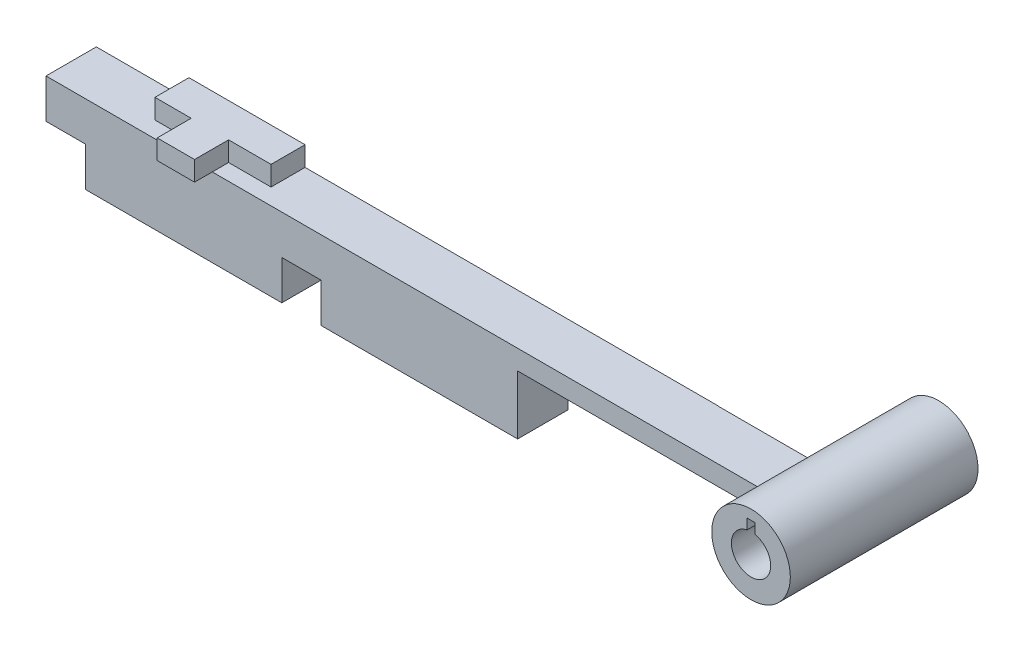
ISO-10303-21;
HEADER;
FILE_DESCRIPTION(('STEP AP214'),'2;1');
FILE_NAME('part.step','',(''),(''),'','','');
FILE_SCHEMA(('AUTOMOTIVE_DESIGN { 1 0 10303 214 1 1 1 1 }'));
ENDSEC;
DATA;
#1=APPLICATION_CONTEXT('core data for automotive mechanical design processes');
#2=APPLICATION_PROTOCOL_DEFINITION('international standard','automotive_design',2000,#1);
#3=PRODUCT_CONTEXT('',#1,'mechanical');
#4=PRODUCT('Part','Part','',(#3));
#5=PRODUCT_RELATED_PRODUCT_CATEGORY('part','',(#4));
#6=PRODUCT_DEFINITION_FORMATION('','',#4);
#7=PRODUCT_DEFINITION_CONTEXT('part definition',#1,'design');
#8=PRODUCT_DEFINITION('design','',#6,#7);
#9=PRODUCT_DEFINITION_SHAPE('','',#8);
#10=(LENGTH_UNIT() NAMED_UNIT(*) SI_UNIT(.MILLI.,.METRE.));
#11=(NAMED_UNIT(*) PLANE_ANGLE_UNIT() SI_UNIT($,.RADIAN.));
#12=(NAMED_UNIT(*) SI_UNIT($,.STERADIAN.) SOLID_ANGLE_UNIT());
#13=UNCERTAINTY_MEASURE_WITH_UNIT(LENGTH_MEASURE(1.E-05),#10,'distance_accuracy_value','');
#14=(GEOMETRIC_REPRESENTATION_CONTEXT(3) GLOBAL_UNCERTAINTY_ASSIGNED_CONTEXT((#13)) GLOBAL_UNIT_ASSIGNED_CONTEXT((#10,
#11,#12)) REPRESENTATION_CONTEXT('',''));
#15=CARTESIAN_POINT('',(0.,0.,0.));
#16=DIRECTION('',(0.,0.,1.));
#17=DIRECTION('',(1.,0.,0.));
#18=AXIS2_PLACEMENT_3D('',#15,#16,#17);
#19=CARTESIAN_POINT('',(41.4283489434981,7.40393666117241,-4.));
#20=DIRECTION('',(0.,0.,1.));
#21=DIRECTION('',(1.,0.,0.));
#22=AXIS2_PLACEMENT_3D('',#19,#20,#21);
#23=PLANE('',#22);
#24=CARTESIAN_POINT('',(41.4283489434981,7.40393666117241,-4.));
#25=DIRECTION('',(0.,0.,1.));
#26=DIRECTION('',(1.,0.,0.));
#27=AXIS2_PLACEMENT_3D('',#24,#25,#26);
#28=CIRCLE('',#27,2.);
#29=CARTESIAN_POINT('',(43.4283489434981,7.40393666117241,-4.));
#30=VERTEX_POINT('',#29);
#31=EDGE_CURVE('E388',#30,#30,#28,.T.);
#32=ORIENTED_EDGE('',*,*,#31,.F.);
#33=EDGE_LOOP('',(#32));
#34=FACE_BOUND('',#33,.T.);
#35=DIRECTION('',(0.,-1.,0.));
#36=VECTOR('',#35,1.);
#37=CARTESIAN_POINT('',(41.6283489434981,7.40393666117241,-4.));
#38=LINE('',#37,#36);
#39=CARTESIAN_POINT('',(41.6283489434981,8.9039366611724,-4.));
#40=VERTEX_POINT('',#39);
#41=CARTESIAN_POINT('',(41.6283489434981,8.38373255828568,-4.));
#42=VERTEX_POINT('',#41);
#43=EDGE_CURVE('E342',#40,#42,#38,.T.);
#44=ORIENTED_EDGE('',*,*,#43,.F.);
#45=DIRECTION('',(-1.,0.,0.));
#46=VECTOR('',#45,1.);
#47=CARTESIAN_POINT('',(41.4283489434981,8.9039366611724,-4.));
#48=LINE('',#47,#46);
#49=CARTESIAN_POINT('',(41.2283489434981,8.9039366611724,-4.));
#50=VERTEX_POINT('',#49);
#51=EDGE_CURVE('E378',#40,#50,#48,.T.);
#52=ORIENTED_EDGE('',*,*,#51,.T.);
#53=DIRECTION('',(0.,-1.,0.));
#54=VECTOR('',#53,1.);
#55=CARTESIAN_POINT('',(41.2283489434981,7.40393666117241,-4.));
#56=LINE('',#55,#54);
#57=CARTESIAN_POINT('',(41.2283489434981,8.38373255828568,-4.));
#58=VERTEX_POINT('',#57);
#59=EDGE_CURVE('E374',#50,#58,#56,.T.);
#60=ORIENTED_EDGE('',*,*,#59,.T.);
#61=CARTESIAN_POINT('',(41.4283489434981,7.40393666117241,-4.));
#62=DIRECTION('',(0.,0.,1.));
#63=DIRECTION('',(1.,0.,0.));
#64=AXIS2_PLACEMENT_3D('',#61,#62,#63);
#65=CIRCLE('',#64,0.999999999999998);
#66=EDGE_CURVE('E366',#58,#42,#65,.T.);
#67=ORIENTED_EDGE('',*,*,#66,.T.);
#68=EDGE_LOOP('',(#44,#52,#60,#67));
#69=FACE_BOUND('',#68,.T.);
#70=ADVANCED_FACE('F120',(#34,#69),#23,.F.);
#71=CARTESIAN_POINT('',(41.4283489434981,7.40393666117241,5.55));
#72=DIRECTION('',(0.,0.,1.));
#73=DIRECTION('',(1.,0.,0.));
#74=AXIS2_PLACEMENT_3D('',#71,#72,#73);
#75=PLANE('',#74);
#76=CARTESIAN_POINT('',(41.4283489434981,7.40393666117241,5.55));
#77=DIRECTION('',(0.,0.,1.));
#78=DIRECTION('',(1.,0.,0.));
#79=AXIS2_PLACEMENT_3D('',#76,#77,#78);
#80=CIRCLE('',#79,2.);
#81=CARTESIAN_POINT('',(43.4283489434981,7.40393666117241,5.55));
#82=VERTEX_POINT('',#81);
#83=EDGE_CURVE('E384',#82,#82,#80,.T.);
#84=ORIENTED_EDGE('',*,*,#83,.T.);
#85=EDGE_LOOP('',(#84));
#86=FACE_BOUND('',#85,.T.);
#87=DIRECTION('',(-1.,0.,0.));
#88=VECTOR('',#87,1.);
#89=CARTESIAN_POINT('',(0.,8.9039366611724,5.55));
#90=LINE('',#89,#88);
#91=CARTESIAN_POINT('',(41.6283489434981,8.9039366611724,5.55));
#92=VERTEX_POINT('',#91);
#93=CARTESIAN_POINT('',(41.2283489434981,8.9039366611724,5.55));
#94=VERTEX_POINT('',#93);
#95=EDGE_CURVE('E356',#92,#94,#90,.T.);
#96=ORIENTED_EDGE('',*,*,#95,.F.);
#97=DIRECTION('',(0.,-1.,0.));
#98=VECTOR('',#97,1.);
#99=CARTESIAN_POINT('',(41.6283489434981,0.,5.55));
#100=LINE('',#99,#98);
#101=CARTESIAN_POINT('',(41.6283489434981,8.38373255828568,5.55));
#102=VERTEX_POINT('',#101);
#103=EDGE_CURVE('E339',#92,#102,#100,.T.);
#104=ORIENTED_EDGE('',*,*,#103,.T.);
#105=CARTESIAN_POINT('',(41.4283489434981,7.40393666117241,5.55));
#106=DIRECTION('',(0.,0.,1.));
#107=DIRECTION('',(1.,0.,0.));
#108=AXIS2_PLACEMENT_3D('',#105,#106,#107);
#109=CIRCLE('',#108,0.999999999999998);
#110=CARTESIAN_POINT('',(41.2283489434981,8.38373255828568,5.55));
#111=VERTEX_POINT('',#110);
#112=EDGE_CURVE('E348',#111,#102,#109,.T.);
#113=ORIENTED_EDGE('',*,*,#112,.F.);
#114=DIRECTION('',(0.,-1.,0.));
#115=VECTOR('',#114,1.);
#116=CARTESIAN_POINT('',(41.2283489434981,0.,5.55));
#117=LINE('',#116,#115);
#118=EDGE_CURVE('E144',#94,#111,#117,.T.);
#119=ORIENTED_EDGE('',*,*,#118,.F.);
#120=EDGE_LOOP('',(#96,#104,#113,#119));
#121=FACE_BOUND('',#120,.T.);
#122=ADVANCED_FACE('F354',(#86,#121),#75,.T.);
#123=CARTESIAN_POINT('',(0.,4.,0.));
#124=DIRECTION('',(0.,1.,0.));
#125=DIRECTION('',(0.,0.,1.));
#126=AXIS2_PLACEMENT_3D('',#123,#124,#125);
#127=PLANE('',#126);
#128=DIRECTION('',(-1.,0.,0.));
#129=VECTOR('',#128,1.);
#130=CARTESIAN_POINT('',(24.,4.,0.));
#131=LINE('',#130,#129);
#132=CARTESIAN_POINT('',(37.4677343950113,4.,0.));
#133=VERTEX_POINT('',#132);
#134=CARTESIAN_POINT('',(24.,4.,0.));
#135=VERTEX_POINT('',#134);
#136=EDGE_CURVE('E624',#133,#135,#131,.T.);
#137=ORIENTED_EDGE('',*,*,#136,.T.);
#138=DIRECTION('',(0.,0.,-1.));
#139=VECTOR('',#138,1.);
#140=CARTESIAN_POINT('',(24.,4.,-3.));
#141=LINE('',#140,#139);
#142=CARTESIAN_POINT('',(24.,4.,-2.56138495518599));
#143=VERTEX_POINT('',#142);
#144=EDGE_CURVE('E479',#135,#143,#141,.T.);
#145=ORIENTED_EDGE('',*,*,#144,.T.);
#146=DIRECTION('',(-1.,0.,0.));
#147=VECTOR('',#146,1.);
#148=CARTESIAN_POINT('',(0.,4.,-2.56138495518599));
#149=LINE('',#148,#147);
#150=CARTESIAN_POINT('',(31.6459245248655,4.,-2.56138495518599));
#151=VERTEX_POINT('',#150);
#152=EDGE_CURVE('E532',#151,#143,#149,.T.);
#153=ORIENTED_EDGE('',*,*,#152,.F.);
#154=DIRECTION('',(0.,0.,1.));
#155=VECTOR('',#154,1.);
#156=CARTESIAN_POINT('',(31.6459245248655,4.,-6.));
#157=LINE('',#156,#155);
#158=CARTESIAN_POINT('',(31.6459245248655,4.,-2.55));
#159=VERTEX_POINT('',#158);
#160=EDGE_CURVE('E474',#151,#159,#157,.T.);
#161=ORIENTED_EDGE('',*,*,#160,.T.);
#162=DIRECTION('',(1.,0.,0.));
#163=VECTOR('',#162,1.);
#164=CARTESIAN_POINT('',(0.,4.,-2.55));
#165=LINE('',#164,#163);
#166=CARTESIAN_POINT('',(37.4677343950113,4.,-2.55));
#167=VERTEX_POINT('',#166);
#168=EDGE_CURVE('E468',#159,#167,#165,.T.);
#169=ORIENTED_EDGE('',*,*,#168,.T.);
#170=DIRECTION('',(0.,0.,1.));
#171=VECTOR('',#170,1.);
#172=CARTESIAN_POINT('',(37.4677343950113,4.,-2.55));
#173=LINE('',#172,#171);
#174=EDGE_CURVE('E455',#167,#133,#173,.T.);
#175=ORIENTED_EDGE('',*,*,#174,.T.);
#176=EDGE_LOOP('',(#137,#145,#153,#161,#169,#175));
#177=FACE_BOUND('',#176,.T.);
#178=ADVANCED_FACE('F691',(#177),#127,.F.);
#179=CARTESIAN_POINT('',(0.,0.,-2.55));
#180=DIRECTION('',(0.,0.,1.));
#181=DIRECTION('',(1.,0.,0.));
#182=AXIS2_PLACEMENT_3D('',#179,#180,#181);
#183=PLANE('',#182);
#184=DIRECTION('',(0.707106781186548,0.707106781186547,0.));
#185=VECTOR('',#184,1.);
#186=CARTESIAN_POINT('',(16.5391427470851,-16.5391427470852,-2.55));
#187=LINE('',#186,#185);
#188=CARTESIAN_POINT('',(39.5410719870473,6.46278649287699,-2.55));
#189=VERTEX_POINT('',#188);
#190=CARTESIAN_POINT('',(39.6225398778147,6.54425438364438,-2.55));
#191=VERTEX_POINT('',#190);
#192=EDGE_CURVE('E406',#189,#191,#187,.T.);
#193=ORIENTED_EDGE('',*,*,#192,.T.);
#194=CARTESIAN_POINT('',(41.4283489434981,7.40393666117241,-2.55));
#195=DIRECTION('',(0.,0.,1.));
#196=DIRECTION('',(1.,0.,0.));
#197=AXIS2_PLACEMENT_3D('',#194,#195,#196);
#198=CIRCLE('',#197,2.);
#199=CARTESIAN_POINT('',(40.56866666597,5.59812759548904,-2.55));
#200=VERTEX_POINT('',#199);
#201=EDGE_CURVE('E395',#191,#200,#198,.T.);
#202=ORIENTED_EDGE('',*,*,#201,.T.);
#203=DIRECTION('',(0.707106781186547,0.707106781186548,0.));
#204=VECTOR('',#203,1.);
#205=CARTESIAN_POINT('',(17.4852695352405,-17.4852695352405,-2.55));
#206=LINE('',#205,#204);
#207=CARTESIAN_POINT('',(40.4779809873777,5.50744191689674,-2.55));
#208=VERTEX_POINT('',#207);
#209=EDGE_CURVE('E403',#208,#200,#206,.T.);
#210=ORIENTED_EDGE('',*,*,#209,.F.);
#211=DIRECTION('',(0.709052823345343,0.705155368486972,0.));
#212=VECTOR('',#211,1.);
#213=CARTESIAN_POINT('',(17.3737578421153,-17.4697841080079,-2.55));
#214=LINE('',#213,#212);
#215=CARTESIAN_POINT('',(39.9677343950113,5.,-2.55));
#216=VERTEX_POINT('',#215);
#217=EDGE_CURVE('E425',#216,#208,#214,.T.);
#218=ORIENTED_EDGE('',*,*,#217,.F.);
#219=CARTESIAN_POINT('',(37.3034046624551,8.0358243313904,-2.55));
#220=DIRECTION('',(0.,0.,1.));
#221=DIRECTION('',(1.,0.,0.));
#222=AXIS2_PLACEMENT_3D('',#219,#220,#221);
#223=CIRCLE('',#222,4.03916851528192);
#224=EDGE_CURVE('E421',#167,#216,#223,.T.);
#225=ORIENTED_EDGE('',*,*,#224,.F.);
#226=ORIENTED_EDGE('',*,*,#168,.F.);
#227=CARTESIAN_POINT('',(34.6039644164153,4.5,-2.55));
#228=DIRECTION('',(0.,0.,1.));
#229=DIRECTION('',(1.,0.,0.));
#230=AXIS2_PLACEMENT_3D('',#227,#228,#229);
#231=CIRCLE('',#230,3.);
#232=CARTESIAN_POINT('',(31.6459245248654,5.,-2.55));
#233=VERTEX_POINT('',#232);
#234=EDGE_CURVE('E679',#159,#233,#231,.F.);
#235=ORIENTED_EDGE('',*,*,#234,.T.);
#236=DIRECTION('',(1.,0.,0.));
#237=VECTOR('',#236,1.);
#238=CARTESIAN_POINT('',(0.,5.,-2.55));
#239=LINE('',#238,#237);
#240=CARTESIAN_POINT('',(37.4677343950113,5.,-2.55));
#241=VERTEX_POINT('',#240);
#242=EDGE_CURVE('E478',#233,#241,#239,.T.);
#243=ORIENTED_EDGE('',*,*,#242,.T.);
#244=CARTESIAN_POINT('',(36.0168371308157,9.08464109660577,-2.55));
#245=DIRECTION('',(0.,0.,1.));
#246=DIRECTION('',(1.,0.,0.));
#247=AXIS2_PLACEMENT_3D('',#244,#245,#246);
#248=CIRCLE('',#247,4.33467366238001);
#249=CARTESIAN_POINT('',(39.016996399566,5.95599280677475,-2.55));
#250=VERTEX_POINT('',#249);
#251=EDGE_CURVE('E433',#241,#250,#248,.T.);
#252=ORIENTED_EDGE('',*,*,#251,.T.);
#253=DIRECTION('',(-0.718859990823633,-0.695154884607053,0.));
#254=VECTOR('',#253,1.);
#255=CARTESIAN_POINT('',(15.8782626038535,-16.4197187741167,-2.55));
#256=LINE('',#255,#254);
#257=EDGE_CURVE('E430',#189,#250,#256,.T.);
#258=ORIENTED_EDGE('',*,*,#257,.F.);
#259=EDGE_LOOP('',(#193,#202,#210,#218,#225,#226,#235,#243,#252,#258));
#260=FACE_BOUND('',#259,.T.);
#261=ADVANCED_FACE('F122',(#260),#183,.F.);
#262=CARTESIAN_POINT('',(34.6039644164153,4.5,-3.99999999999999));
#263=DIRECTION('',(0.,0.,1.));
#264=DIRECTION('',(1.,0.,0.));
#265=AXIS2_PLACEMENT_3D('',#262,#263,#264);
#266=CYLINDRICAL_SURFACE('',#265,3.);
#267=ORIENTED_EDGE('',*,*,#234,.F.);
#268=ORIENTED_EDGE('',*,*,#160,.F.);
#269=CARTESIAN_POINT('',(34.6039644164153,4.5,-2.56138495518599));
#270=DIRECTION('',(0.,0.,-1.));
#271=DIRECTION('',(-1.,0.,0.));
#272=AXIS2_PLACEMENT_3D('',#269,#270,#271);
#273=CIRCLE('',#272,3.);
#274=CARTESIAN_POINT('',(31.6459245248655,5.,-2.56138495518599));
#275=VERTEX_POINT('',#274);
#276=EDGE_CURVE('E675',#151,#275,#273,.T.);
#277=ORIENTED_EDGE('',*,*,#276,.T.);
#278=DIRECTION('',(0.,0.,1.));
#279=VECTOR('',#278,1.);
#280=CARTESIAN_POINT('',(31.6459245248655,5.,-6.));
#281=LINE('',#280,#279);
#282=EDGE_CURVE('E515',#233,#275,#281,.F.);
#283=ORIENTED_EDGE('',*,*,#282,.F.);
#284=EDGE_LOOP('',(#267,#268,#277,#283));
#285=FACE_BOUND('',#284,.T.);
#286=ADVANCED_FACE('F800',(#285),#266,.F.);
#287=CARTESIAN_POINT('',(0.,5.,0.));
#288=DIRECTION('',(0.,-1.,0.));
#289=DIRECTION('',(0.,0.,-1.));
#290=AXIS2_PLACEMENT_3D('',#287,#288,#289);
#291=PLANE('',#290);
#292=DIRECTION('',(0.,0.,1.));
#293=VECTOR('',#292,1.);
#294=CARTESIAN_POINT('',(37.4677343950113,5.,-2.55));
#295=LINE('',#294,#293);
#296=CARTESIAN_POINT('',(37.4677343950113,5.,0.));
#297=VERTEX_POINT('',#296);
#298=EDGE_CURVE('E458',#241,#297,#295,.T.);
#299=ORIENTED_EDGE('',*,*,#298,.F.);
#300=ORIENTED_EDGE('',*,*,#242,.F.);
#301=ORIENTED_EDGE('',*,*,#282,.T.);
#302=DIRECTION('',(1.,0.,0.));
#303=VECTOR('',#302,1.);
#304=CARTESIAN_POINT('',(0.,5.,-2.56138495518599));
#305=LINE('',#304,#303);
#306=CARTESIAN_POINT('',(10.6224946458156,5.,-2.56138495518599));
#307=VERTEX_POINT('',#306);
#308=EDGE_CURVE('E571',#307,#275,#305,.T.);
#309=ORIENTED_EDGE('',*,*,#308,.F.);
#310=DIRECTION('',(0.,0.,-1.));
#311=VECTOR('',#310,1.);
#312=CARTESIAN_POINT('',(10.6224946458156,5.,0.));
#313=LINE('',#312,#311);
#314=CARTESIAN_POINT('',(10.6224946458156,5.,-0.829910231061604));
#315=VERTEX_POINT('',#314);
#316=EDGE_CURVE('E563',#315,#307,#313,.T.);
#317=ORIENTED_EDGE('',*,*,#316,.F.);
#318=DIRECTION('',(1.,0.,0.));
#319=VECTOR('',#318,1.);
#320=CARTESIAN_POINT('',(0.,5.,-0.829910231061604));
#321=LINE('',#320,#319);
#322=CARTESIAN_POINT('',(8.46116474012604,5.,-0.829910231061604));
#323=VERTEX_POINT('',#322);
#324=EDGE_CURVE('E557',#323,#315,#321,.T.);
#325=ORIENTED_EDGE('',*,*,#324,.F.);
#326=DIRECTION('',(0.,0.,-1.));
#327=VECTOR('',#326,1.);
#328=CARTESIAN_POINT('',(8.46116474012604,5.,0.));
#329=LINE('',#328,#327);
#330=CARTESIAN_POINT('',(8.46116474012603,5.,0.));
#331=VERTEX_POINT('',#330);
#332=EDGE_CURVE('E558',#331,#323,#329,.T.);
#333=ORIENTED_EDGE('',*,*,#332,.F.);
#334=DIRECTION('',(1.,0.,0.));
#335=VECTOR('',#334,1.);
#336=CARTESIAN_POINT('',(0.,5.,0.));
#337=LINE('',#336,#335);
#338=EDGE_CURVE('E645',#331,#297,#337,.T.);
#339=ORIENTED_EDGE('',*,*,#338,.T.);
#340=EDGE_LOOP('',(#299,#300,#301,#309,#317,#325,#333,#339));
#341=FACE_BOUND('',#340,.T.);
#342=ADVANCED_FACE('F796',(#341),#291,.F.);
#343=CARTESIAN_POINT('',(0.,3.,0.));
#344=DIRECTION('',(0.,1.,0.));
#345=DIRECTION('',(0.,0.,1.));
#346=AXIS2_PLACEMENT_3D('',#343,#344,#345);
#347=PLANE('',#346);
#348=DIRECTION('',(-1.,0.,0.));
#349=VECTOR('',#348,1.);
#350=CARTESIAN_POINT('',(0.,3.,-2.56138495518599));
#351=LINE('',#350,#349);
#352=CARTESIAN_POINT('',(2.,3.,-2.56138495518599));
#353=VERTEX_POINT('',#352);
#354=CARTESIAN_POINT('',(0.,3.,-2.56138495518599));
#355=VERTEX_POINT('',#354);
#356=EDGE_CURVE('E472',#353,#355,#351,.T.);
#357=ORIENTED_EDGE('',*,*,#356,.F.);
#358=DIRECTION('',(0.,0.,1.));
#359=VECTOR('',#358,1.);
#360=CARTESIAN_POINT('',(2.,3.,0.));
#361=LINE('',#360,#359);
#362=CARTESIAN_POINT('',(2.,3.,0.));
#363=VERTEX_POINT('',#362);
#364=EDGE_CURVE('E512',#353,#363,#361,.T.);
#365=ORIENTED_EDGE('',*,*,#364,.T.);
#366=DIRECTION('',(-1.,0.,0.));
#367=VECTOR('',#366,1.);
#368=CARTESIAN_POINT('',(0.,3.,0.));
#369=LINE('',#368,#367);
#370=CARTESIAN_POINT('',(0.,3.,0.));
#371=VERTEX_POINT('',#370);
#372=EDGE_CURVE('E496',#363,#371,#369,.T.);
#373=ORIENTED_EDGE('',*,*,#372,.T.);
#374=DIRECTION('',(0.,0.,-1.));
#375=VECTOR('',#374,1.);
#376=CARTESIAN_POINT('',(0.,3.,-10.));
#377=LINE('',#376,#375);
#378=EDGE_CURVE('E495',#371,#355,#377,.T.);
#379=ORIENTED_EDGE('',*,*,#378,.T.);
#380=EDGE_LOOP('',(#357,#365,#373,#379));
#381=FACE_BOUND('',#380,.T.);
#382=ADVANCED_FACE('F747',(#381),#347,.F.);
#383=DIRECTION('',(-1.,0.,0.));
#384=VECTOR('',#383,1.);
#385=CARTESIAN_POINT('',(0.,3.,-2.56138495518599));
#386=LINE('',#385,#384);
#387=CARTESIAN_POINT('',(14.,3.,-2.56138495518599));
#388=VERTEX_POINT('',#387);
#389=CARTESIAN_POINT('',(12.,3.,-2.56138495518599));
#390=VERTEX_POINT('',#389);
#391=EDGE_CURVE('E473',#388,#390,#386,.T.);
#392=ORIENTED_EDGE('',*,*,#391,.F.);
#393=DIRECTION('',(0.,0.,-1.));
#394=VECTOR('',#393,1.);
#395=CARTESIAN_POINT('',(14.,3.,0.));
#396=LINE('',#395,#394);
#397=CARTESIAN_POINT('',(14.,3.,0.));
#398=VERTEX_POINT('',#397);
#399=EDGE_CURVE('E523',#398,#388,#396,.T.);
#400=ORIENTED_EDGE('',*,*,#399,.F.);
#401=CARTESIAN_POINT('',(12.,3.,0.));
#402=VERTEX_POINT('',#401);
#403=EDGE_CURVE('E491',#398,#402,#369,.T.);
#404=ORIENTED_EDGE('',*,*,#403,.T.);
#405=DIRECTION('',(0.,0.,-1.));
#406=VECTOR('',#405,1.);
#407=CARTESIAN_POINT('',(12.,3.,0.));
#408=LINE('',#407,#406);
#409=EDGE_CURVE('E490',#402,#390,#408,.T.);
#410=ORIENTED_EDGE('',*,*,#409,.T.);
#411=EDGE_LOOP('',(#392,#400,#404,#410));
#412=FACE_BOUND('',#411,.T.);
#413=ADVANCED_FACE('F732',(#412),#347,.F.);
#414=DIRECTION('',(1.,0.,0.));
#415=VECTOR('',#414,1.);
#416=CARTESIAN_POINT('',(0.,5.,-2.56138495518599));
#417=LINE('',#416,#415);
#418=CARTESIAN_POINT('',(0.,5.,-2.56138495518599));
#419=VERTEX_POINT('',#418);
#420=CARTESIAN_POINT('',(4.71318899208484,5.,-2.56138495518599));
#421=VERTEX_POINT('',#420);
#422=EDGE_CURVE('E620',#419,#421,#417,.T.);
#423=ORIENTED_EDGE('',*,*,#422,.F.);
#424=DIRECTION('',(0.,0.,1.));
#425=VECTOR('',#424,1.);
#426=CARTESIAN_POINT('',(0.,5.,0.));
#427=LINE('',#426,#425);
#428=CARTESIAN_POINT('',(0.,5.,0.));
#429=VERTEX_POINT('',#428);
#430=EDGE_CURVE('E486',#419,#429,#427,.T.);
#431=ORIENTED_EDGE('',*,*,#430,.T.);
#432=CARTESIAN_POINT('',(6.55927588976973,5.,0.));
#433=VERTEX_POINT('',#432);
#434=EDGE_CURVE('E489',#429,#433,#337,.T.);
#435=ORIENTED_EDGE('',*,*,#434,.T.);
#436=DIRECTION('',(0.,0.,-1.));
#437=VECTOR('',#436,1.);
#438=CARTESIAN_POINT('',(6.55927588976973,5.,0.));
#439=LINE('',#438,#437);
#440=CARTESIAN_POINT('',(6.55927588976973,5.,-0.829910231061604));
#441=VERTEX_POINT('',#440);
#442=EDGE_CURVE('E587',#433,#441,#439,.T.);
#443=ORIENTED_EDGE('',*,*,#442,.T.);
#444=DIRECTION('',(1.,0.,0.));
#445=VECTOR('',#444,1.);
#446=CARTESIAN_POINT('',(0.,5.,-0.829910231061604));
#447=LINE('',#446,#445);
#448=CARTESIAN_POINT('',(4.71318899208484,5.,-0.829910231061604));
#449=VERTEX_POINT('',#448);
#450=EDGE_CURVE('E537',#449,#441,#447,.T.);
#451=ORIENTED_EDGE('',*,*,#450,.F.);
#452=DIRECTION('',(0.,0.,-1.));
#453=VECTOR('',#452,1.);
#454=CARTESIAN_POINT('',(4.71318899208484,5.,0.));
#455=LINE('',#454,#453);
#456=EDGE_CURVE('E591',#449,#421,#455,.T.);
#457=ORIENTED_EDGE('',*,*,#456,.T.);
#458=EDGE_LOOP('',(#423,#431,#435,#443,#451,#457));
#459=FACE_BOUND('',#458,.T.);
#460=ADVANCED_FACE('F758',(#459),#291,.F.);
#461=CARTESIAN_POINT('',(0.,5.,0.));
#462=DIRECTION('',(1.,0.,0.));
#463=DIRECTION('',(0.,0.,-1.));
#464=AXIS2_PLACEMENT_3D('',#461,#462,#463);
#465=PLANE('',#464);
#466=DIRECTION('',(0.,-1.,0.));
#467=VECTOR('',#466,1.);
#468=CARTESIAN_POINT('',(0.,7.,-2.56138495518599));
#469=LINE('',#468,#467);
#470=EDGE_CURVE('E595',#419,#355,#469,.T.);
#471=ORIENTED_EDGE('',*,*,#470,.T.);
#472=ORIENTED_EDGE('',*,*,#378,.F.);
#473=DIRECTION('',(0.,-1.,0.));
#474=VECTOR('',#473,1.);
#475=CARTESIAN_POINT('',(0.,5.,0.));
#476=LINE('',#475,#474);
#477=EDGE_CURVE('E480',#429,#371,#476,.T.);
#478=ORIENTED_EDGE('',*,*,#477,.F.);
#479=ORIENTED_EDGE('',*,*,#430,.F.);
#480=EDGE_LOOP('',(#471,#472,#478,#479));
#481=FACE_BOUND('',#480,.T.);
#482=ADVANCED_FACE('F751',(#481),#465,.F.);
#483=CARTESIAN_POINT('',(2.,-6.,0.));
#484=DIRECTION('',(-1.,0.,0.));
#485=DIRECTION('',(0.,0.,1.));
#486=AXIS2_PLACEMENT_3D('',#483,#484,#485);
#487=PLANE('',#486);
#488=ORIENTED_EDGE('',*,*,#364,.F.);
#489=DIRECTION('',(0.,-1.,0.));
#490=VECTOR('',#489,1.);
#491=CARTESIAN_POINT('',(2.,-6.,-2.56138495518599));
#492=LINE('',#491,#490);
#493=CARTESIAN_POINT('',(2.,0.999999999999975,-2.56138495518599));
#494=VERTEX_POINT('',#493);
#495=EDGE_CURVE('E508',#353,#494,#492,.T.);
#496=ORIENTED_EDGE('',*,*,#495,.T.);
#497=DIRECTION('',(0.,0.,-1.));
#498=VECTOR('',#497,1.);
#499=CARTESIAN_POINT('',(2.,0.999999999999975,-3.));
#500=LINE('',#499,#498);
#501=CARTESIAN_POINT('',(2.,0.999999999999975,0.));
#502=VERTEX_POINT('',#501);
#503=EDGE_CURVE('E485',#502,#494,#500,.T.);
#504=ORIENTED_EDGE('',*,*,#503,.F.);
#505=DIRECTION('',(0.,1.,0.));
#506=VECTOR('',#505,1.);
#507=CARTESIAN_POINT('',(2.,-6.,0.));
#508=LINE('',#507,#506);
#509=EDGE_CURVE('E503',#502,#363,#508,.T.);
#510=ORIENTED_EDGE('',*,*,#509,.T.);
#511=EDGE_LOOP('',(#488,#496,#504,#510));
#512=FACE_BOUND('',#511,.T.);
#513=ADVANCED_FACE('F744',(#512),#487,.T.);
#514=CARTESIAN_POINT('',(12.,-6.,0.));
#515=DIRECTION('',(1.,0.,0.));
#516=DIRECTION('',(0.,0.,-1.));
#517=AXIS2_PLACEMENT_3D('',#514,#515,#516);
#518=PLANE('',#517);
#519=DIRECTION('',(0.,0.,1.));
#520=VECTOR('',#519,1.);
#521=CARTESIAN_POINT('',(12.,0.999999999999975,-3.));
#522=LINE('',#521,#520);
#523=CARTESIAN_POINT('',(12.,0.999999999999975,-2.56138495518599));
#524=VERTEX_POINT('',#523);
#525=CARTESIAN_POINT('',(12.,0.999999999999975,0.));
#526=VERTEX_POINT('',#525);
#527=EDGE_CURVE('E629',#524,#526,#522,.T.);
#528=ORIENTED_EDGE('',*,*,#527,.F.);
#529=DIRECTION('',(0.,1.,0.));
#530=VECTOR('',#529,1.);
#531=CARTESIAN_POINT('',(12.,-6.,-2.56138495518599));
#532=LINE('',#531,#530);
#533=EDGE_CURVE('E507',#524,#390,#532,.T.);
#534=ORIENTED_EDGE('',*,*,#533,.T.);
#535=ORIENTED_EDGE('',*,*,#409,.F.);
#536=DIRECTION('',(0.,1.,0.));
#537=VECTOR('',#536,1.);
#538=CARTESIAN_POINT('',(12.,-6.,0.));
#539=LINE('',#538,#537);
#540=EDGE_CURVE('E484',#526,#402,#539,.T.);
#541=ORIENTED_EDGE('',*,*,#540,.F.);
#542=EDGE_LOOP('',(#528,#534,#535,#541));
#543=FACE_BOUND('',#542,.T.);
#544=ADVANCED_FACE('F736',(#543),#518,.T.);
#545=CARTESIAN_POINT('',(24.,-6.00000000000002,0.));
#546=DIRECTION('',(-1.,0.,0.));
#547=DIRECTION('',(0.,0.,1.));
#548=AXIS2_PLACEMENT_3D('',#545,#546,#547);
#549=PLANE('',#548);
#550=DIRECTION('',(0.,-1.,0.));
#551=VECTOR('',#550,1.);
#552=CARTESIAN_POINT('',(24.,-6.00000000000002,-2.56138495518599));
#553=LINE('',#552,#551);
#554=CARTESIAN_POINT('',(24.,0.999999999999975,-2.56138495518599));
#555=VERTEX_POINT('',#554);
#556=EDGE_CURVE('E653',#143,#555,#553,.T.);
#557=ORIENTED_EDGE('',*,*,#556,.F.);
#558=ORIENTED_EDGE('',*,*,#144,.F.);
#559=DIRECTION('',(0.,1.,0.));
#560=VECTOR('',#559,1.);
#561=CARTESIAN_POINT('',(24.,-6.00000000000002,0.));
#562=LINE('',#561,#560);
#563=CARTESIAN_POINT('',(24.,0.999999999999975,0.));
#564=VERTEX_POINT('',#563);
#565=EDGE_CURVE('E502',#564,#135,#562,.T.);
#566=ORIENTED_EDGE('',*,*,#565,.F.);
#567=DIRECTION('',(0.,0.,1.));
#568=VECTOR('',#567,1.);
#569=CARTESIAN_POINT('',(24.,0.999999999999975,-3.));
#570=LINE('',#569,#568);
#571=EDGE_CURVE('E603',#555,#564,#570,.T.);
#572=ORIENTED_EDGE('',*,*,#571,.F.);
#573=EDGE_LOOP('',(#557,#558,#566,#572));
#574=FACE_BOUND('',#573,.T.);
#575=ADVANCED_FACE('F712',(#574),#549,.F.);
#576=CARTESIAN_POINT('',(14.,-6.00000000000002,0.));
#577=DIRECTION('',(1.,0.,0.));
#578=DIRECTION('',(0.,0.,-1.));
#579=AXIS2_PLACEMENT_3D('',#576,#577,#578);
#580=PLANE('',#579);
#581=DIRECTION('',(0.,1.,0.));
#582=VECTOR('',#581,1.);
#583=CARTESIAN_POINT('',(14.,-6.00000000000002,-2.56138495518599));
#584=LINE('',#583,#582);
#585=CARTESIAN_POINT('',(14.,0.999999999999975,-2.56138495518599));
#586=VERTEX_POINT('',#585);
#587=EDGE_CURVE('E659',#586,#388,#584,.T.);
#588=ORIENTED_EDGE('',*,*,#587,.F.);
#589=DIRECTION('',(0.,0.,-1.));
#590=VECTOR('',#589,1.);
#591=CARTESIAN_POINT('',(14.,0.999999999999975,-3.));
#592=LINE('',#591,#590);
#593=CARTESIAN_POINT('',(14.,0.999999999999975,0.));
#594=VERTEX_POINT('',#593);
#595=EDGE_CURVE('E625',#594,#586,#592,.T.);
#596=ORIENTED_EDGE('',*,*,#595,.F.);
#597=DIRECTION('',(0.,1.,0.));
#598=VECTOR('',#597,1.);
#599=CARTESIAN_POINT('',(14.,-6.00000000000002,0.));
#600=LINE('',#599,#598);
#601=EDGE_CURVE('E520',#594,#398,#600,.T.);
#602=ORIENTED_EDGE('',*,*,#601,.T.);
#603=ORIENTED_EDGE('',*,*,#399,.T.);
#604=EDGE_LOOP('',(#588,#596,#602,#603));
#605=FACE_BOUND('',#604,.T.);
#606=ADVANCED_FACE('F724',(#605),#580,.F.);
#607=CARTESIAN_POINT('',(0.,6.,0.));
#608=DIRECTION('',(0.,1.,0.));
#609=DIRECTION('',(0.,0.,1.));
#610=AXIS2_PLACEMENT_3D('',#607,#608,#609);
#611=PLANE('',#610);
#612=DIRECTION('',(0.,0.,-1.));
#613=VECTOR('',#612,1.);
#614=CARTESIAN_POINT('',(10.6224946458156,6.,0.));
#615=LINE('',#614,#613);
#616=CARTESIAN_POINT('',(10.6224946458156,6.,-0.829910231061604));
#617=VERTEX_POINT('',#616);
#618=CARTESIAN_POINT('',(10.6224946458156,6.,-2.56138495518599));
#619=VERTEX_POINT('',#618);
#620=EDGE_CURVE('E527',#617,#619,#615,.T.);
#621=ORIENTED_EDGE('',*,*,#620,.T.);
#622=DIRECTION('',(1.,0.,0.));
#623=VECTOR('',#622,1.);
#624=CARTESIAN_POINT('',(0.,6.,-2.56138495518599));
#625=LINE('',#624,#623);
#626=CARTESIAN_POINT('',(4.71318899208484,6.,-2.56138495518599));
#627=VERTEX_POINT('',#626);
#628=EDGE_CURVE('E572',#627,#619,#625,.T.);
#629=ORIENTED_EDGE('',*,*,#628,.F.);
#630=DIRECTION('',(0.,0.,-1.));
#631=VECTOR('',#630,1.);
#632=CARTESIAN_POINT('',(4.71318899208484,6.,0.));
#633=LINE('',#632,#631);
#634=CARTESIAN_POINT('',(4.71318899208484,6.,-0.829910231061604));
#635=VERTEX_POINT('',#634);
#636=EDGE_CURVE('E538',#635,#627,#633,.T.);
#637=ORIENTED_EDGE('',*,*,#636,.F.);
#638=DIRECTION('',(1.,0.,0.));
#639=VECTOR('',#638,1.);
#640=CARTESIAN_POINT('',(0.,6.,-0.829910231061604));
#641=LINE('',#640,#639);
#642=CARTESIAN_POINT('',(6.55927588976973,6.,-0.829910231061604));
#643=VERTEX_POINT('',#642);
#644=EDGE_CURVE('E599',#635,#643,#641,.T.);
#645=ORIENTED_EDGE('',*,*,#644,.T.);
#646=DIRECTION('',(0.,0.,-1.));
#647=VECTOR('',#646,1.);
#648=CARTESIAN_POINT('',(6.55927588976973,6.,0.));
#649=LINE('',#648,#647);
#650=CARTESIAN_POINT('',(6.55927588976973,6.,0.901189681812298));
#651=VERTEX_POINT('',#650);
#652=EDGE_CURVE('E543',#651,#643,#649,.T.);
#653=ORIENTED_EDGE('',*,*,#652,.F.);
#654=DIRECTION('',(1.,0.,0.));
#655=VECTOR('',#654,1.);
#656=CARTESIAN_POINT('',(0.,6.,0.901189681812298));
#657=LINE('',#656,#655);
#658=CARTESIAN_POINT('',(8.46116474012604,6.,0.901189681812298));
#659=VERTEX_POINT('',#658);
#660=EDGE_CURVE('E607',#651,#659,#657,.T.);
#661=ORIENTED_EDGE('',*,*,#660,.T.);
#662=DIRECTION('',(0.,0.,-1.));
#663=VECTOR('',#662,1.);
#664=CARTESIAN_POINT('',(8.46116474012604,6.,0.));
#665=LINE('',#664,#663);
#666=CARTESIAN_POINT('',(8.46116474012604,6.,-0.829910231061604));
#667=VERTEX_POINT('',#666);
#668=EDGE_CURVE('E604',#659,#667,#665,.T.);
#669=ORIENTED_EDGE('',*,*,#668,.T.);
#670=DIRECTION('',(1.,0.,0.));
#671=VECTOR('',#670,1.);
#672=CARTESIAN_POINT('',(0.,6.,-0.829910231061604));
#673=LINE('',#672,#671);
#674=EDGE_CURVE('E600',#667,#617,#673,.T.);
#675=ORIENTED_EDGE('',*,*,#674,.T.);
#676=EDGE_LOOP('',(#621,#629,#637,#645,#653,#661,#669,#675));
#677=FACE_BOUND('',#676,.T.);
#678=ADVANCED_FACE('F779',(#677),#611,.T.);
#679=CARTESIAN_POINT('',(0.,0.999999999999975,0.));
#680=DIRECTION('',(0.,1.,0.));
#681=DIRECTION('',(0.,0.,1.));
#682=AXIS2_PLACEMENT_3D('',#679,#680,#681);
#683=PLANE('',#682);
#684=DIRECTION('',(-1.,0.,0.));
#685=VECTOR('',#684,1.);
#686=CARTESIAN_POINT('',(0.,0.999999999999975,-2.56138495518599));
#687=LINE('',#686,#685);
#688=EDGE_CURVE('E656',#555,#586,#687,.T.);
#689=ORIENTED_EDGE('',*,*,#688,.F.);
#690=ORIENTED_EDGE('',*,*,#571,.T.);
#691=DIRECTION('',(-1.,0.,0.));
#692=VECTOR('',#691,1.);
#693=CARTESIAN_POINT('',(14.,0.999999999999975,0.));
#694=LINE('',#693,#692);
#695=EDGE_CURVE('E630',#564,#594,#694,.T.);
#696=ORIENTED_EDGE('',*,*,#695,.T.);
#697=ORIENTED_EDGE('',*,*,#595,.T.);
#698=EDGE_LOOP('',(#689,#690,#696,#697));
#699=FACE_BOUND('',#698,.T.);
#700=ADVANCED_FACE('F720',(#699),#683,.F.);
#701=CARTESIAN_POINT('',(0.,0.999999999999975,0.));
#702=DIRECTION('',(0.,1.,0.));
#703=DIRECTION('',(0.,0.,1.));
#704=AXIS2_PLACEMENT_3D('',#701,#702,#703);
#705=PLANE('',#704);
#706=DIRECTION('',(-1.,0.,0.));
#707=VECTOR('',#706,1.);
#708=CARTESIAN_POINT('',(0.,0.999999999999975,-2.56138495518599));
#709=LINE('',#708,#707);
#710=EDGE_CURVE('E469',#524,#494,#709,.T.);
#711=ORIENTED_EDGE('',*,*,#710,.F.);
#712=ORIENTED_EDGE('',*,*,#527,.T.);
#713=DIRECTION('',(-1.,0.,0.));
#714=VECTOR('',#713,1.);
#715=CARTESIAN_POINT('',(2.,0.999999999999975,0.));
#716=LINE('',#715,#714);
#717=EDGE_CURVE('E635',#526,#502,#716,.T.);
#718=ORIENTED_EDGE('',*,*,#717,.T.);
#719=ORIENTED_EDGE('',*,*,#503,.T.);
#720=EDGE_LOOP('',(#711,#712,#718,#719));
#721=FACE_BOUND('',#720,.T.);
#722=ADVANCED_FACE('F738',(#721),#705,.F.);
#723=CARTESIAN_POINT('',(0.,5.,0.));
#724=DIRECTION('',(0.,0.,-1.));
#725=DIRECTION('',(-1.,0.,0.));
#726=AXIS2_PLACEMENT_3D('',#723,#724,#725);
#727=PLANE('',#726);
#728=DIRECTION('',(0.707106781186547,0.707106781186548,0.));
#729=VECTOR('',#728,1.);
#730=CARTESIAN_POINT('',(17.4852695352405,-17.4852695352405,0.));
#731=LINE('',#730,#729);
#732=CARTESIAN_POINT('',(40.4779809873777,5.50744191689674,0.));
#733=VERTEX_POINT('',#732);
#734=CARTESIAN_POINT('',(40.56866666597,5.59812759548903,0.));
#735=VERTEX_POINT('',#734);
#736=EDGE_CURVE('E402',#733,#735,#731,.T.);
#737=ORIENTED_EDGE('',*,*,#736,.T.);
#738=CARTESIAN_POINT('',(41.4283489434981,7.40393666117241,0.));
#739=DIRECTION('',(0.,0.,-1.));
#740=DIRECTION('',(-1.,0.,0.));
#741=AXIS2_PLACEMENT_3D('',#738,#739,#740);
#742=CIRCLE('',#741,2.);
#743=CARTESIAN_POINT('',(39.6225398778147,6.54425438364438,0.));
#744=VERTEX_POINT('',#743);
#745=EDGE_CURVE('E392',#735,#744,#742,.T.);
#746=ORIENTED_EDGE('',*,*,#745,.T.);
#747=DIRECTION('',(0.707106781186548,0.707106781186547,0.));
#748=VECTOR('',#747,1.);
#749=CARTESIAN_POINT('',(16.5391427470851,-16.5391427470852,0.));
#750=LINE('',#749,#748);
#751=CARTESIAN_POINT('',(39.5410719870473,6.46278649287699,0.));
#752=VERTEX_POINT('',#751);
#753=EDGE_CURVE('E407',#752,#744,#750,.T.);
#754=ORIENTED_EDGE('',*,*,#753,.F.);
#755=DIRECTION('',(-0.718859990823633,-0.695154884607053,0.));
#756=VECTOR('',#755,1.);
#757=CARTESIAN_POINT('',(15.8782626038535,-16.4197187741167,0.));
#758=LINE('',#757,#756);
#759=CARTESIAN_POINT('',(39.016996399566,5.95599280677475,0.));
#760=VERTEX_POINT('',#759);
#761=EDGE_CURVE('E445',#752,#760,#758,.T.);
#762=ORIENTED_EDGE('',*,*,#761,.T.);
#763=CARTESIAN_POINT('',(36.0168371308157,9.08464109660577,0.));
#764=DIRECTION('',(0.,0.,1.));
#765=DIRECTION('',(1.,0.,0.));
#766=AXIS2_PLACEMENT_3D('',#763,#764,#765);
#767=CIRCLE('',#766,4.33467366238001);
#768=EDGE_CURVE('E426',#297,#760,#767,.T.);
#769=ORIENTED_EDGE('',*,*,#768,.F.);
#770=ORIENTED_EDGE('',*,*,#338,.F.);
#771=DIRECTION('',(1.,0.,0.));
#772=VECTOR('',#771,1.);
#773=CARTESIAN_POINT('',(0.,5.,0.));
#774=LINE('',#773,#772);
#775=EDGE_CURVE('E528',#433,#331,#774,.T.);
#776=ORIENTED_EDGE('',*,*,#775,.F.);
#777=ORIENTED_EDGE('',*,*,#434,.F.);
#778=ORIENTED_EDGE('',*,*,#477,.T.);
#779=ORIENTED_EDGE('',*,*,#372,.F.);
#780=ORIENTED_EDGE('',*,*,#509,.F.);
#781=ORIENTED_EDGE('',*,*,#717,.F.);
#782=ORIENTED_EDGE('',*,*,#540,.T.);
#783=ORIENTED_EDGE('',*,*,#403,.F.);
#784=ORIENTED_EDGE('',*,*,#601,.F.);
#785=ORIENTED_EDGE('',*,*,#695,.F.);
#786=ORIENTED_EDGE('',*,*,#565,.T.);
#787=ORIENTED_EDGE('',*,*,#136,.F.);
#788=CARTESIAN_POINT('',(37.3034046624551,8.0358243313904,0.));
#789=DIRECTION('',(0.,0.,1.));
#790=DIRECTION('',(1.,0.,0.));
#791=AXIS2_PLACEMENT_3D('',#788,#789,#790);
#792=CIRCLE('',#791,4.03916851528192);
#793=CARTESIAN_POINT('',(39.9677343950113,5.,0.));
#794=VERTEX_POINT('',#793);
#795=EDGE_CURVE('E420',#133,#794,#792,.T.);
#796=ORIENTED_EDGE('',*,*,#795,.T.);
#797=DIRECTION('',(0.709052823345343,0.705155368486972,0.));
#798=VECTOR('',#797,1.);
#799=CARTESIAN_POINT('',(17.3737578421153,-17.4697841080079,0.));
#800=LINE('',#799,#798);
#801=EDGE_CURVE('E441',#794,#733,#800,.T.);
#802=ORIENTED_EDGE('',*,*,#801,.T.);
#803=EDGE_LOOP('',(#737,#746,#754,#762,#769,#770,#776,#777,#778,#779,#780,#781,#782,#783,#784,
#785,#786,#787,#796,#802));
#804=FACE_BOUND('',#803,.T.);
#805=ADVANCED_FACE('F706',(#804),#727,.F.);
#806=CARTESIAN_POINT('',(0.,5.,0.));
#807=DIRECTION('',(0.,1.,0.));
#808=DIRECTION('',(0.,0.,1.));
#809=AXIS2_PLACEMENT_3D('',#806,#807,#808);
#810=PLANE('',#809);
#811=CARTESIAN_POINT('',(6.55927588976973,5.,0.901189681812298));
#812=VERTEX_POINT('',#811);
#813=EDGE_CURVE('E519',#812,#433,#439,.T.);
#814=ORIENTED_EDGE('',*,*,#813,.T.);
#815=ORIENTED_EDGE('',*,*,#775,.T.);
#816=CARTESIAN_POINT('',(8.46116474012604,5.,0.901189681812298));
#817=VERTEX_POINT('',#816);
#818=EDGE_CURVE('E552',#817,#331,#329,.T.);
#819=ORIENTED_EDGE('',*,*,#818,.F.);
#820=DIRECTION('',(1.,0.,0.));
#821=VECTOR('',#820,1.);
#822=CARTESIAN_POINT('',(0.,5.,0.901189681812298));
#823=LINE('',#822,#821);
#824=EDGE_CURVE('E548',#812,#817,#823,.T.);
#825=ORIENTED_EDGE('',*,*,#824,.F.);
#826=EDGE_LOOP('',(#814,#815,#819,#825));
#827=FACE_BOUND('',#826,.T.);
#828=ADVANCED_FACE('F766',(#827),#810,.F.);
#829=CARTESIAN_POINT('',(0.,6.,-2.56138495518599));
#830=DIRECTION('',(0.,0.,-1.));
#831=DIRECTION('',(-1.,0.,0.));
#832=AXIS2_PLACEMENT_3D('',#829,#830,#831);
#833=PLANE('',#832);
#834=ORIENTED_EDGE('',*,*,#276,.F.);
#835=ORIENTED_EDGE('',*,*,#152,.T.);
#836=ORIENTED_EDGE('',*,*,#556,.T.);
#837=ORIENTED_EDGE('',*,*,#688,.T.);
#838=ORIENTED_EDGE('',*,*,#587,.T.);
#839=ORIENTED_EDGE('',*,*,#391,.T.);
#840=ORIENTED_EDGE('',*,*,#533,.F.);
#841=ORIENTED_EDGE('',*,*,#710,.T.);
#842=ORIENTED_EDGE('',*,*,#495,.F.);
#843=ORIENTED_EDGE('',*,*,#356,.T.);
#844=ORIENTED_EDGE('',*,*,#470,.F.);
#845=ORIENTED_EDGE('',*,*,#422,.T.);
#846=DIRECTION('',(0.,-1.,0.));
#847=VECTOR('',#846,1.);
#848=CARTESIAN_POINT('',(4.71318899208484,6.,-2.56138495518599));
#849=LINE('',#848,#847);
#850=EDGE_CURVE('E533',#627,#421,#849,.T.);
#851=ORIENTED_EDGE('',*,*,#850,.F.);
#852=ORIENTED_EDGE('',*,*,#628,.T.);
#853=DIRECTION('',(0.,-1.,0.));
#854=VECTOR('',#853,1.);
#855=CARTESIAN_POINT('',(10.6224946458156,6.,-2.56138495518599));
#856=LINE('',#855,#854);
#857=EDGE_CURVE('E567',#619,#307,#856,.T.);
#858=ORIENTED_EDGE('',*,*,#857,.T.);
#859=ORIENTED_EDGE('',*,*,#308,.T.);
#860=EDGE_LOOP('',(#834,#835,#836,#837,#838,#839,#840,#841,#842,#843,#844,#845,#851,#852,#858,#859));
#861=FACE_BOUND('',#860,.T.);
#862=ADVANCED_FACE('F717',(#861),#833,.T.);
#863=CARTESIAN_POINT('',(4.71318899208484,6.,0.));
#864=DIRECTION('',(-1.,0.,0.));
#865=DIRECTION('',(0.,0.,1.));
#866=AXIS2_PLACEMENT_3D('',#863,#864,#865);
#867=PLANE('',#866);
#868=ORIENTED_EDGE('',*,*,#456,.F.);
#869=DIRECTION('',(0.,-1.,0.));
#870=VECTOR('',#869,1.);
#871=CARTESIAN_POINT('',(4.71318899208484,6.,-0.829910231061604));
#872=LINE('',#871,#870);
#873=EDGE_CURVE('E539',#635,#449,#872,.T.);
#874=ORIENTED_EDGE('',*,*,#873,.F.);
#875=ORIENTED_EDGE('',*,*,#636,.T.);
#876=ORIENTED_EDGE('',*,*,#850,.T.);
#877=EDGE_LOOP('',(#868,#874,#875,#876));
#878=FACE_BOUND('',#877,.T.);
#879=ADVANCED_FACE('F789',(#878),#867,.T.);
#880=CARTESIAN_POINT('',(0.,6.,-0.829910231061604));
#881=DIRECTION('',(0.,0.,-1.));
#882=DIRECTION('',(-1.,0.,0.));
#883=AXIS2_PLACEMENT_3D('',#880,#881,#882);
#884=PLANE('',#883);
#885=ORIENTED_EDGE('',*,*,#450,.T.);
#886=DIRECTION('',(0.,-1.,0.));
#887=VECTOR('',#886,1.);
#888=CARTESIAN_POINT('',(6.55927588976973,6.,-0.829910231061604));
#889=LINE('',#888,#887);
#890=EDGE_CURVE('E544',#643,#441,#889,.T.);
#891=ORIENTED_EDGE('',*,*,#890,.F.);
#892=ORIENTED_EDGE('',*,*,#644,.F.);
#893=ORIENTED_EDGE('',*,*,#873,.T.);
#894=EDGE_LOOP('',(#885,#891,#892,#893));
#895=FACE_BOUND('',#894,.T.);
#896=ADVANCED_FACE('F786',(#895),#884,.F.);
#897=CARTESIAN_POINT('',(6.55927588976973,6.,0.));
#898=DIRECTION('',(-1.,0.,0.));
#899=DIRECTION('',(0.,0.,1.));
#900=AXIS2_PLACEMENT_3D('',#897,#898,#899);
#901=PLANE('',#900);
#902=ORIENTED_EDGE('',*,*,#813,.F.);
#903=DIRECTION('',(0.,-1.,0.));
#904=VECTOR('',#903,1.);
#905=CARTESIAN_POINT('',(6.55927588976973,6.,0.901189681812298));
#906=LINE('',#905,#904);
#907=EDGE_CURVE('E549',#651,#812,#906,.T.);
#908=ORIENTED_EDGE('',*,*,#907,.F.);
#909=ORIENTED_EDGE('',*,*,#652,.T.);
#910=ORIENTED_EDGE('',*,*,#890,.T.);
#911=ORIENTED_EDGE('',*,*,#442,.F.);
#912=EDGE_LOOP('',(#902,#908,#909,#910,#911));
#913=FACE_BOUND('',#912,.T.);
#914=ADVANCED_FACE('F761',(#913),#901,.T.);
#915=CARTESIAN_POINT('',(0.,6.,0.901189681812298));
#916=DIRECTION('',(0.,0.,-1.));
#917=DIRECTION('',(-1.,0.,0.));
#918=AXIS2_PLACEMENT_3D('',#915,#916,#917);
#919=PLANE('',#918);
#920=ORIENTED_EDGE('',*,*,#824,.T.);
#921=DIRECTION('',(0.,-1.,0.));
#922=VECTOR('',#921,1.);
#923=CARTESIAN_POINT('',(8.46116474012604,6.,0.901189681812298));
#924=LINE('',#923,#922);
#925=EDGE_CURVE('E553',#659,#817,#924,.T.);
#926=ORIENTED_EDGE('',*,*,#925,.F.);
#927=ORIENTED_EDGE('',*,*,#660,.F.);
#928=ORIENTED_EDGE('',*,*,#907,.T.);
#929=EDGE_LOOP('',(#920,#926,#927,#928));
#930=FACE_BOUND('',#929,.T.);
#931=ADVANCED_FACE('F770',(#930),#919,.F.);
#932=CARTESIAN_POINT('',(8.46116474012604,6.,0.));
#933=DIRECTION('',(-1.,0.,0.));
#934=DIRECTION('',(0.,0.,1.));
#935=AXIS2_PLACEMENT_3D('',#932,#933,#934);
#936=PLANE('',#935);
#937=ORIENTED_EDGE('',*,*,#818,.T.);
#938=ORIENTED_EDGE('',*,*,#332,.T.);
#939=DIRECTION('',(0.,-1.,0.));
#940=VECTOR('',#939,1.);
#941=CARTESIAN_POINT('',(8.46116474012604,6.,-0.829910231061604));
#942=LINE('',#941,#940);
#943=EDGE_CURVE('E559',#667,#323,#942,.T.);
#944=ORIENTED_EDGE('',*,*,#943,.F.);
#945=ORIENTED_EDGE('',*,*,#668,.F.);
#946=ORIENTED_EDGE('',*,*,#925,.T.);
#947=EDGE_LOOP('',(#937,#938,#944,#945,#946));
#948=FACE_BOUND('',#947,.T.);
#949=ADVANCED_FACE('F774',(#948),#936,.F.);
#950=CARTESIAN_POINT('',(0.,6.,-0.829910231061604));
#951=DIRECTION('',(0.,0.,-1.));
#952=DIRECTION('',(-1.,0.,0.));
#953=AXIS2_PLACEMENT_3D('',#950,#951,#952);
#954=PLANE('',#953);
#955=ORIENTED_EDGE('',*,*,#324,.T.);
#956=DIRECTION('',(0.,-1.,0.));
#957=VECTOR('',#956,1.);
#958=CARTESIAN_POINT('',(10.6224946458156,6.,-0.829910231061604));
#959=LINE('',#958,#957);
#960=EDGE_CURVE('E129',#617,#315,#959,.T.);
#961=ORIENTED_EDGE('',*,*,#960,.F.);
#962=ORIENTED_EDGE('',*,*,#674,.F.);
#963=ORIENTED_EDGE('',*,*,#943,.T.);
#964=EDGE_LOOP('',(#955,#961,#962,#963));
#965=FACE_BOUND('',#964,.T.);
#966=ADVANCED_FACE('F984',(#965),#954,.F.);
#967=CARTESIAN_POINT('',(10.6224946458156,6.,0.));
#968=DIRECTION('',(-1.,0.,0.));
#969=DIRECTION('',(0.,0.,1.));
#970=AXIS2_PLACEMENT_3D('',#967,#968,#969);
#971=PLANE('',#970);
#972=ORIENTED_EDGE('',*,*,#316,.T.);
#973=ORIENTED_EDGE('',*,*,#857,.F.);
#974=ORIENTED_EDGE('',*,*,#620,.F.);
#975=ORIENTED_EDGE('',*,*,#960,.T.);
#976=EDGE_LOOP('',(#972,#973,#974,#975));
#977=FACE_BOUND('',#976,.T.);
#978=ADVANCED_FACE('F793',(#977),#971,.F.);
#979=CARTESIAN_POINT('',(15.8782626038535,-16.4197187741167,-2.55));
#980=DIRECTION('',(-0.695154884607053,0.718859990823633,0.));
#981=DIRECTION('',(-0.718859990823633,-0.695154884607053,0.));
#982=AXIS2_PLACEMENT_3D('',#979,#980,#981);
#983=PLANE('',#982);
#984=DIRECTION('',(0.,0.,1.));
#985=VECTOR('',#984,1.);
#986=CARTESIAN_POINT('',(39.5410719870473,6.46278649287698,-4.));
#987=LINE('',#986,#985);
#988=EDGE_CURVE('E411',#189,#752,#987,.T.);
#989=ORIENTED_EDGE('',*,*,#988,.F.);
#990=ORIENTED_EDGE('',*,*,#257,.T.);
#991=DIRECTION('',(0.,0.,1.));
#992=VECTOR('',#991,1.);
#993=CARTESIAN_POINT('',(39.016996399566,5.95599280677475,-2.55));
#994=LINE('',#993,#992);
#995=EDGE_CURVE('E451',#250,#760,#994,.T.);
#996=ORIENTED_EDGE('',*,*,#995,.T.);
#997=ORIENTED_EDGE('',*,*,#761,.F.);
#998=EDGE_LOOP('',(#989,#990,#996,#997));
#999=FACE_BOUND('',#998,.T.);
#1000=ADVANCED_FACE('F810',(#999),#983,.T.);
#1001=CARTESIAN_POINT('',(17.3737578421153,-17.4697841080079,-2.55));
#1002=DIRECTION('',(0.705155368486972,-0.709052823345343,0.));
#1003=DIRECTION('',(0.709052823345343,0.705155368486972,0.));
#1004=AXIS2_PLACEMENT_3D('',#1001,#1002,#1003);
#1005=PLANE('',#1004);
#1006=DIRECTION('',(0.,0.,1.));
#1007=VECTOR('',#1006,1.);
#1008=CARTESIAN_POINT('',(40.4779809873777,5.50744191689674,-4.));
#1009=LINE('',#1008,#1007);
#1010=EDGE_CURVE('E462',#733,#208,#1009,.F.);
#1011=ORIENTED_EDGE('',*,*,#1010,.F.);
#1012=ORIENTED_EDGE('',*,*,#801,.F.);
#1013=DIRECTION('',(0.,0.,1.));
#1014=VECTOR('',#1013,1.);
#1015=CARTESIAN_POINT('',(39.9677343950113,5.,-2.55));
#1016=LINE('',#1015,#1014);
#1017=EDGE_CURVE('E437',#216,#794,#1016,.T.);
#1018=ORIENTED_EDGE('',*,*,#1017,.F.);
#1019=ORIENTED_EDGE('',*,*,#217,.T.);
#1020=EDGE_LOOP('',(#1011,#1012,#1018,#1019));
#1021=FACE_BOUND('',#1020,.T.);
#1022=ADVANCED_FACE('F703',(#1021),#1005,.T.);
#1023=CARTESIAN_POINT('',(37.3034046624551,8.0358243313904,-2.55));
#1024=DIRECTION('',(0.,0.,1.));
#1025=DIRECTION('',(1.,0.,0.));
#1026=AXIS2_PLACEMENT_3D('',#1023,#1024,#1025);
#1027=CYLINDRICAL_SURFACE('',#1026,4.03916851528192);
#1028=ORIENTED_EDGE('',*,*,#795,.F.);
#1029=ORIENTED_EDGE('',*,*,#174,.F.);
#1030=ORIENTED_EDGE('',*,*,#224,.T.);
#1031=ORIENTED_EDGE('',*,*,#1017,.T.);
#1032=EDGE_LOOP('',(#1028,#1029,#1030,#1031));
#1033=FACE_BOUND('',#1032,.T.);
#1034=ADVANCED_FACE('F698',(#1033),#1027,.T.);
#1035=CARTESIAN_POINT('',(36.0168371308157,9.08464109660577,-2.55));
#1036=DIRECTION('',(0.,0.,1.));
#1037=DIRECTION('',(1.,0.,0.));
#1038=AXIS2_PLACEMENT_3D('',#1035,#1036,#1037);
#1039=CYLINDRICAL_SURFACE('',#1038,4.33467366238001);
#1040=ORIENTED_EDGE('',*,*,#768,.T.);
#1041=ORIENTED_EDGE('',*,*,#995,.F.);
#1042=ORIENTED_EDGE('',*,*,#251,.F.);
#1043=ORIENTED_EDGE('',*,*,#298,.T.);
#1044=EDGE_LOOP('',(#1040,#1041,#1042,#1043));
#1045=FACE_BOUND('',#1044,.T.);
#1046=ADVANCED_FACE('F806',(#1045),#1039,.F.);
#1047=CARTESIAN_POINT('',(16.5391427470851,-16.5391427470852,-2.55));
#1048=DIRECTION('',(0.707106781186547,-0.707106781186548,0.));
#1049=DIRECTION('',(0.707106781186548,0.707106781186547,0.));
#1050=AXIS2_PLACEMENT_3D('',#1047,#1048,#1049);
#1051=PLANE('',#1050);
#1052=ORIENTED_EDGE('',*,*,#753,.T.);
#1053=DIRECTION('',(0.,0.,1.));
#1054=VECTOR('',#1053,1.);
#1055=CARTESIAN_POINT('',(39.6225398778147,6.54425438364439,-4.));
#1056=LINE('',#1055,#1054);
#1057=EDGE_CURVE('E399',#744,#191,#1056,.F.);
#1058=ORIENTED_EDGE('',*,*,#1057,.T.);
#1059=ORIENTED_EDGE('',*,*,#192,.F.);
#1060=ORIENTED_EDGE('',*,*,#988,.T.);
#1061=EDGE_LOOP('',(#1052,#1058,#1059,#1060));
#1062=FACE_BOUND('',#1061,.T.);
#1063=ADVANCED_FACE('F820',(#1062),#1051,.F.);
#1064=CARTESIAN_POINT('',(17.4852695352405,-17.4852695352405,-2.55));
#1065=DIRECTION('',(0.707106781186548,-0.707106781186547,0.));
#1066=DIRECTION('',(0.707106781186547,0.707106781186548,0.));
#1067=AXIS2_PLACEMENT_3D('',#1064,#1065,#1066);
#1068=PLANE('',#1067);
#1069=DIRECTION('',(0.,0.,1.));
#1070=VECTOR('',#1069,1.);
#1071=CARTESIAN_POINT('',(40.56866666597,5.59812759548904,-4.));
#1072=LINE('',#1071,#1070);
#1073=EDGE_CURVE('E12',#735,#200,#1072,.F.);
#1074=ORIENTED_EDGE('',*,*,#1073,.F.);
#1075=ORIENTED_EDGE('',*,*,#736,.F.);
#1076=ORIENTED_EDGE('',*,*,#1010,.T.);
#1077=ORIENTED_EDGE('',*,*,#209,.T.);
#1078=EDGE_LOOP('',(#1074,#1075,#1076,#1077));
#1079=FACE_BOUND('',#1078,.T.);
#1080=ADVANCED_FACE('F818',(#1079),#1068,.T.);
#1081=CARTESIAN_POINT('',(41.4283489434981,7.40393666117241,-4.));
#1082=DIRECTION('',(0.,0.,1.));
#1083=DIRECTION('',(1.,0.,0.));
#1084=AXIS2_PLACEMENT_3D('',#1081,#1082,#1083);
#1085=CYLINDRICAL_SURFACE('',#1084,2.);
#1086=ORIENTED_EDGE('',*,*,#83,.F.);
#1087=EDGE_LOOP('',(#1086));
#1088=FACE_BOUND('',#1087,.T.);
#1089=ORIENTED_EDGE('',*,*,#31,.T.);
#1090=EDGE_LOOP('',(#1089));
#1091=FACE_BOUND('',#1090,.T.);
#1092=ORIENTED_EDGE('',*,*,#1057,.F.);
#1093=ORIENTED_EDGE('',*,*,#745,.F.);
#1094=ORIENTED_EDGE('',*,*,#1073,.T.);
#1095=ORIENTED_EDGE('',*,*,#201,.F.);
#1096=EDGE_LOOP('',(#1092,#1093,#1094,#1095));
#1097=FACE_BOUND('',#1096,.T.);
#1098=ADVANCED_FACE('F815',(#1088,#1091,#1097),#1085,.T.);
#1099=CARTESIAN_POINT('',(41.6283489434981,0.,-8.));
#1100=DIRECTION('',(-1.,0.,0.));
#1101=DIRECTION('',(0.,0.,1.));
#1102=AXIS2_PLACEMENT_3D('',#1099,#1100,#1101);
#1103=PLANE('',#1102);
#1104=ORIENTED_EDGE('',*,*,#43,.T.);
#1105=DIRECTION('',(0.,0.,1.));
#1106=VECTOR('',#1105,1.);
#1107=CARTESIAN_POINT('',(41.6283489434981,8.38373255828568,-8.));
#1108=LINE('',#1107,#1106);
#1109=EDGE_CURVE('E136',#42,#102,#1108,.T.);
#1110=ORIENTED_EDGE('',*,*,#1109,.T.);
#1111=ORIENTED_EDGE('',*,*,#103,.F.);
#1112=DIRECTION('',(0.,0.,1.));
#1113=VECTOR('',#1112,1.);
#1114=CARTESIAN_POINT('',(41.6283489434981,8.9039366611724,-8.));
#1115=LINE('',#1114,#1113);
#1116=EDGE_CURVE('E345',#40,#92,#1115,.T.);
#1117=ORIENTED_EDGE('',*,*,#1116,.F.);
#1118=EDGE_LOOP('',(#1104,#1110,#1111,#1117));
#1119=FACE_BOUND('',#1118,.T.);
#1120=ADVANCED_FACE('F336',(#1119),#1103,.T.);
#1121=CARTESIAN_POINT('',(0.,8.9039366611724,-8.));
#1122=DIRECTION('',(0.,1.,0.));
#1123=DIRECTION('',(0.,0.,1.));
#1124=AXIS2_PLACEMENT_3D('',#1121,#1122,#1123);
#1125=PLANE('',#1124);
#1126=ORIENTED_EDGE('',*,*,#1116,.T.);
#1127=ORIENTED_EDGE('',*,*,#95,.T.);
#1128=DIRECTION('',(0.,0.,1.));
#1129=VECTOR('',#1128,1.);
#1130=CARTESIAN_POINT('',(41.2283489434981,8.9039366611724,-8.));
#1131=LINE('',#1130,#1129);
#1132=EDGE_CURVE('E367',#50,#94,#1131,.T.);
#1133=ORIENTED_EDGE('',*,*,#1132,.F.);
#1134=ORIENTED_EDGE('',*,*,#51,.F.);
#1135=EDGE_LOOP('',(#1126,#1127,#1133,#1134));
#1136=FACE_BOUND('',#1135,.T.);
#1137=ADVANCED_FACE('F846',(#1136),#1125,.F.);
#1138=CARTESIAN_POINT('',(41.2283489434981,0.,-8.));
#1139=DIRECTION('',(-1.,0.,0.));
#1140=DIRECTION('',(0.,0.,1.));
#1141=AXIS2_PLACEMENT_3D('',#1138,#1139,#1140);
#1142=PLANE('',#1141);
#1143=ORIENTED_EDGE('',*,*,#1132,.T.);
#1144=ORIENTED_EDGE('',*,*,#118,.T.);
#1145=DIRECTION('',(0.,0.,1.));
#1146=VECTOR('',#1145,1.);
#1147=CARTESIAN_POINT('',(41.2283489434981,8.38373255828568,-8.));
#1148=LINE('',#1147,#1146);
#1149=EDGE_CURVE('E350',#58,#111,#1148,.T.);
#1150=ORIENTED_EDGE('',*,*,#1149,.F.);
#1151=ORIENTED_EDGE('',*,*,#59,.F.);
#1152=EDGE_LOOP('',(#1143,#1144,#1150,#1151));
#1153=FACE_BOUND('',#1152,.T.);
#1154=ADVANCED_FACE('F853',(#1153),#1142,.F.);
#1155=CARTESIAN_POINT('',(41.4283489434981,7.40393666117241,-8.));
#1156=DIRECTION('',(0.,0.,1.));
#1157=DIRECTION('',(1.,0.,0.));
#1158=AXIS2_PLACEMENT_3D('',#1155,#1156,#1157);
#1159=CYLINDRICAL_SURFACE('',#1158,0.999999999999998);
#1160=ORIENTED_EDGE('',*,*,#1149,.T.);
#1161=ORIENTED_EDGE('',*,*,#112,.T.);
#1162=ORIENTED_EDGE('',*,*,#1109,.F.);
#1163=ORIENTED_EDGE('',*,*,#66,.F.);
#1164=EDGE_LOOP('',(#1160,#1161,#1162,#1163));
#1165=FACE_BOUND('',#1164,.T.);
#1166=ADVANCED_FACE('F349',(#1165),#1159,.F.);
#1167=CLOSED_SHELL('',(#70,#122,#178,#261,#286,#342,#382,#413,#460,#482,#513,#544,#575,#606,
#678,#700,#722,#805,#828,#862,#879,#896,#914,#931,#949,#966,#978,#1000,#1022,#1034,#1046,#1063,
#1080,#1098,#1120,#1137,#1154,#1166));
#1168=MANIFOLD_SOLID_BREP('B2',#1167);
#1169=ADVANCED_BREP_SHAPE_REPRESENTATION('',(#18,#1168),#14);
#1170=SHAPE_DEFINITION_REPRESENTATION(#9,#1169);
ENDSEC;
END-ISO-10303-21;
